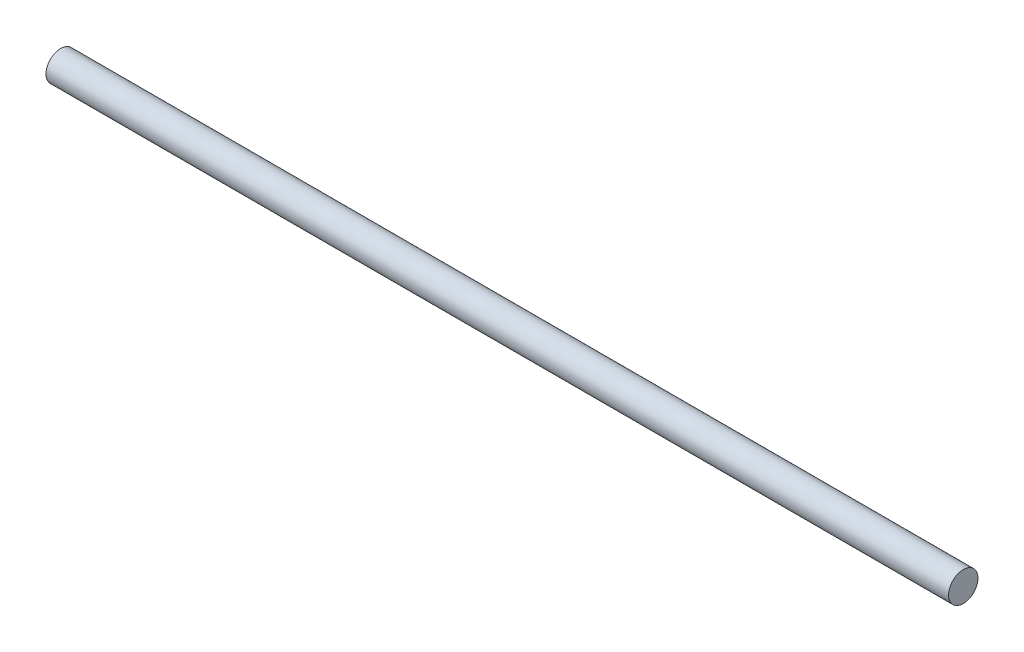
ISO-10303-21;
HEADER;
FILE_DESCRIPTION(('STEP AP214'),'2;1');
FILE_NAME('part.step','',(''),(''),'','','');
FILE_SCHEMA(('AUTOMOTIVE_DESIGN { 1 0 10303 214 1 1 1 1 }'));
ENDSEC;
DATA;
#1=APPLICATION_CONTEXT('core data for automotive mechanical design processes');
#2=APPLICATION_PROTOCOL_DEFINITION('international standard','automotive_design',2000,#1);
#3=PRODUCT_CONTEXT('',#1,'mechanical');
#4=PRODUCT('Part','Part','',(#3));
#5=PRODUCT_RELATED_PRODUCT_CATEGORY('part','',(#4));
#6=PRODUCT_DEFINITION_FORMATION('','',#4);
#7=PRODUCT_DEFINITION_CONTEXT('part definition',#1,'design');
#8=PRODUCT_DEFINITION('design','',#6,#7);
#9=PRODUCT_DEFINITION_SHAPE('','',#8);
#10=(LENGTH_UNIT() NAMED_UNIT(*) SI_UNIT(.MILLI.,.METRE.));
#11=(NAMED_UNIT(*) PLANE_ANGLE_UNIT() SI_UNIT($,.RADIAN.));
#12=(NAMED_UNIT(*) SI_UNIT($,.STERADIAN.) SOLID_ANGLE_UNIT());
#13=UNCERTAINTY_MEASURE_WITH_UNIT(LENGTH_MEASURE(1.E-05),#10,'distance_accuracy_value','');
#14=(GEOMETRIC_REPRESENTATION_CONTEXT(3) GLOBAL_UNCERTAINTY_ASSIGNED_CONTEXT((#13)) GLOBAL_UNIT_ASSIGNED_CONTEXT((#10,
#11,#12)) REPRESENTATION_CONTEXT('',''));
#15=CARTESIAN_POINT('',(0.,0.,0.));
#16=DIRECTION('',(0.,0.,1.));
#17=DIRECTION('',(1.,0.,0.));
#18=AXIS2_PLACEMENT_3D('',#15,#16,#17);
#19=CARTESIAN_POINT('',(2760.,0.,0.));
#20=DIRECTION('',(-1.,0.,0.));
#21=DIRECTION('',(0.,0.,1.));
#22=AXIS2_PLACEMENT_3D('',#19,#20,#21);
#23=CYLINDRICAL_SURFACE('',#22,45.);
#24=CARTESIAN_POINT('',(2760.,0.,0.));
#25=DIRECTION('',(1.,0.,0.));
#26=DIRECTION('',(0.,0.,-1.));
#27=AXIS2_PLACEMENT_3D('',#24,#25,#26);
#28=CIRCLE('',#27,45.);
#29=CARTESIAN_POINT('',(2760.,0.,-45.));
#30=VERTEX_POINT('',#29);
#31=EDGE_CURVE('E10',#30,#30,#28,.T.);
#32=ORIENTED_EDGE('',*,*,#31,.F.);
#33=EDGE_LOOP('',(#32));
#34=FACE_BOUND('',#33,.T.);
#35=CARTESIAN_POINT('',(0.,0.,0.));
#36=DIRECTION('',(1.,0.,0.));
#37=DIRECTION('',(0.,0.,-1.));
#38=AXIS2_PLACEMENT_3D('',#35,#36,#37);
#39=CIRCLE('',#38,45.);
#40=CARTESIAN_POINT('',(0.,0.,-45.));
#41=VERTEX_POINT('',#40);
#42=EDGE_CURVE('E40',#41,#41,#39,.T.);
#43=ORIENTED_EDGE('',*,*,#42,.T.);
#44=EDGE_LOOP('',(#43));
#45=FACE_BOUND('',#44,.T.);
#46=ADVANCED_FACE('F37',(#34,#45),#23,.T.);
#47=CARTESIAN_POINT('',(2760.,0.,0.));
#48=DIRECTION('',(1.,0.,0.));
#49=DIRECTION('',(0.,0.,-1.));
#50=AXIS2_PLACEMENT_3D('',#47,#48,#49);
#51=PLANE('',#50);
#52=ORIENTED_EDGE('',*,*,#31,.T.);
#53=EDGE_LOOP('',(#52));
#54=FACE_BOUND('',#53,.T.);
#55=ADVANCED_FACE('F54',(#54),#51,.T.);
#56=CARTESIAN_POINT('',(0.,0.,0.));
#57=DIRECTION('',(1.,0.,0.));
#58=DIRECTION('',(0.,0.,-1.));
#59=AXIS2_PLACEMENT_3D('',#56,#57,#58);
#60=PLANE('',#59);
#61=ORIENTED_EDGE('',*,*,#42,.F.);
#62=EDGE_LOOP('',(#61));
#63=FACE_BOUND('',#62,.T.);
#64=ADVANCED_FACE('F52',(#63),#60,.F.);
#65=CLOSED_SHELL('',(#46,#55,#64));
#66=MANIFOLD_SOLID_BREP('B2',#65);
#67=ADVANCED_BREP_SHAPE_REPRESENTATION('',(#18,#66),#14);
#68=SHAPE_DEFINITION_REPRESENTATION(#9,#67);
ENDSEC;
END-ISO-10303-21;
